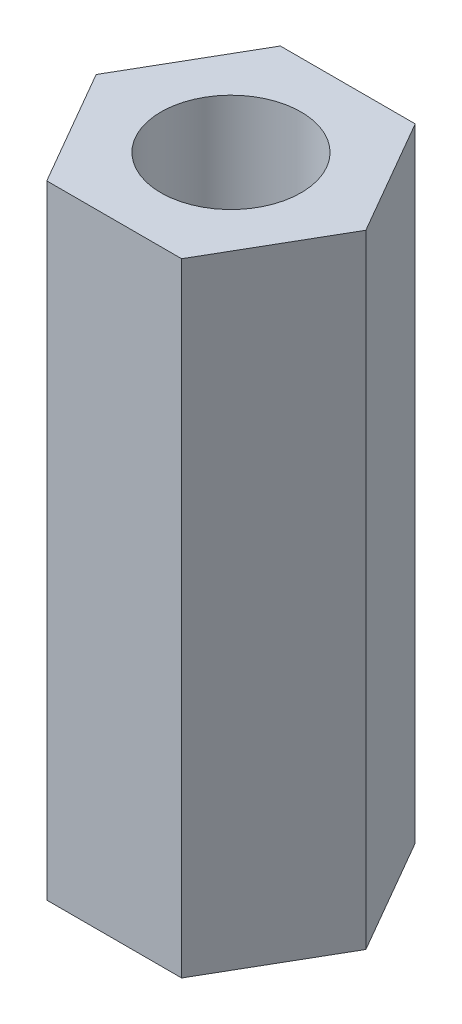
ISO-10303-21;
HEADER;
FILE_DESCRIPTION(('STEP AP214'),'2;1');
FILE_NAME('part.step','',(''),(''),'','','');
FILE_SCHEMA(('AUTOMOTIVE_DESIGN { 1 0 10303 214 1 1 1 1 }'));
ENDSEC;
DATA;
#1=APPLICATION_CONTEXT('core data for automotive mechanical design processes');
#2=APPLICATION_PROTOCOL_DEFINITION('international standard','automotive_design',2000,#1);
#3=PRODUCT_CONTEXT('',#1,'mechanical');
#4=PRODUCT('Part','Part','',(#3));
#5=PRODUCT_RELATED_PRODUCT_CATEGORY('part','',(#4));
#6=PRODUCT_DEFINITION_FORMATION('','',#4);
#7=PRODUCT_DEFINITION_CONTEXT('part definition',#1,'design');
#8=PRODUCT_DEFINITION('design','',#6,#7);
#9=PRODUCT_DEFINITION_SHAPE('','',#8);
#10=(LENGTH_UNIT() NAMED_UNIT(*) SI_UNIT(.MILLI.,.METRE.));
#11=(NAMED_UNIT(*) PLANE_ANGLE_UNIT() SI_UNIT($,.RADIAN.));
#12=(NAMED_UNIT(*) SI_UNIT($,.STERADIAN.) SOLID_ANGLE_UNIT());
#13=UNCERTAINTY_MEASURE_WITH_UNIT(LENGTH_MEASURE(1.E-05),#10,'distance_accuracy_value','');
#14=(GEOMETRIC_REPRESENTATION_CONTEXT(3) GLOBAL_UNCERTAINTY_ASSIGNED_CONTEXT((#13)) GLOBAL_UNIT_ASSIGNED_CONTEXT((#10,
#11,#12)) REPRESENTATION_CONTEXT('',''));
#15=CARTESIAN_POINT('',(0.,0.,0.));
#16=DIRECTION('',(0.,0.,1.));
#17=DIRECTION('',(1.,0.,0.));
#18=AXIS2_PLACEMENT_3D('',#15,#16,#17);
#19=CARTESIAN_POINT('',(-2.59807621135332,12.,0.));
#20=DIRECTION('',(0.866025403784438,0.,-0.5));
#21=DIRECTION('',(-0.5,0.,-0.866025403784439));
#22=AXIS2_PLACEMENT_3D('',#19,#20,#21);
#23=PLANE('',#22);
#24=DIRECTION('',(0.5,0.,0.866025403784439));
#25=VECTOR('',#24,1.);
#26=CARTESIAN_POINT('',(-2.59807621135332,0.,0.));
#27=LINE('',#26,#25);
#28=CARTESIAN_POINT('',(-2.59807621135332,0.,0.));
#29=VERTEX_POINT('',#28);
#30=CARTESIAN_POINT('',(-1.29903810567666,0.,2.25));
#31=VERTEX_POINT('',#30);
#32=EDGE_CURVE('E116',#29,#31,#27,.T.);
#33=ORIENTED_EDGE('',*,*,#32,.T.);
#34=DIRECTION('',(0.,-1.,0.));
#35=VECTOR('',#34,1.);
#36=CARTESIAN_POINT('',(-1.29903810567666,12.,2.25));
#37=LINE('',#36,#35);
#38=CARTESIAN_POINT('',(-1.29903810567666,12.,2.25));
#39=VERTEX_POINT('',#38);
#40=EDGE_CURVE('E11',#39,#31,#37,.T.);
#41=ORIENTED_EDGE('',*,*,#40,.F.);
#42=DIRECTION('',(0.5,0.,0.866025403784439));
#43=VECTOR('',#42,1.);
#44=CARTESIAN_POINT('',(-2.59807621135332,12.,0.));
#45=LINE('',#44,#43);
#46=CARTESIAN_POINT('',(-2.59807621135332,12.,0.));
#47=VERTEX_POINT('',#46);
#48=EDGE_CURVE('E127',#47,#39,#45,.T.);
#49=ORIENTED_EDGE('',*,*,#48,.F.);
#50=DIRECTION('',(0.,-1.,0.));
#51=VECTOR('',#50,1.);
#52=CARTESIAN_POINT('',(-2.59807621135332,12.,0.));
#53=LINE('',#52,#51);
#54=EDGE_CURVE('E112',#47,#29,#53,.T.);
#55=ORIENTED_EDGE('',*,*,#54,.T.);
#56=EDGE_LOOP('',(#33,#41,#49,#55));
#57=FACE_BOUND('',#56,.T.);
#58=ADVANCED_FACE('F32',(#57),#23,.F.);
#59=CARTESIAN_POINT('',(-1.29903810567666,12.,2.25));
#60=DIRECTION('',(0.,0.,-1.));
#61=DIRECTION('',(-1.,0.,0.));
#62=AXIS2_PLACEMENT_3D('',#59,#60,#61);
#63=PLANE('',#62);
#64=DIRECTION('',(1.,0.,0.));
#65=VECTOR('',#64,1.);
#66=CARTESIAN_POINT('',(-1.29903810567666,0.,2.25));
#67=LINE('',#66,#65);
#68=CARTESIAN_POINT('',(1.29903810567666,0.,2.25));
#69=VERTEX_POINT('',#68);
#70=EDGE_CURVE('E119',#31,#69,#67,.T.);
#71=ORIENTED_EDGE('',*,*,#70,.T.);
#72=DIRECTION('',(0.,-1.,0.));
#73=VECTOR('',#72,1.);
#74=CARTESIAN_POINT('',(1.29903810567666,12.,2.25));
#75=LINE('',#74,#73);
#76=CARTESIAN_POINT('',(1.29903810567666,12.,2.25));
#77=VERTEX_POINT('',#76);
#78=EDGE_CURVE('E40',#77,#69,#75,.T.);
#79=ORIENTED_EDGE('',*,*,#78,.F.);
#80=DIRECTION('',(1.,0.,0.));
#81=VECTOR('',#80,1.);
#82=CARTESIAN_POINT('',(-1.29903810567666,12.,2.25));
#83=LINE('',#82,#81);
#84=EDGE_CURVE('E85',#39,#77,#83,.T.);
#85=ORIENTED_EDGE('',*,*,#84,.F.);
#86=ORIENTED_EDGE('',*,*,#40,.T.);
#87=EDGE_LOOP('',(#71,#79,#85,#86));
#88=FACE_BOUND('',#87,.T.);
#89=ADVANCED_FACE('F152',(#88),#63,.F.);
#90=CARTESIAN_POINT('',(1.29903810567666,12.,2.25));
#91=DIRECTION('',(-0.866025403784439,0.,-0.5));
#92=DIRECTION('',(-0.5,0.,0.866025403784439));
#93=AXIS2_PLACEMENT_3D('',#90,#91,#92);
#94=PLANE('',#93);
#95=DIRECTION('',(0.5,0.,-0.866025403784439));
#96=VECTOR('',#95,1.);
#97=CARTESIAN_POINT('',(1.29903810567666,0.,2.25));
#98=LINE('',#97,#96);
#99=CARTESIAN_POINT('',(2.59807621135332,0.,0.));
#100=VERTEX_POINT('',#99);
#101=EDGE_CURVE('E122',#69,#100,#98,.T.);
#102=ORIENTED_EDGE('',*,*,#101,.T.);
#103=DIRECTION('',(0.,-1.,0.));
#104=VECTOR('',#103,1.);
#105=CARTESIAN_POINT('',(2.59807621135332,12.,0.));
#106=LINE('',#105,#104);
#107=CARTESIAN_POINT('',(2.59807621135332,12.,0.));
#108=VERTEX_POINT('',#107);
#109=EDGE_CURVE('E107',#108,#100,#106,.T.);
#110=ORIENTED_EDGE('',*,*,#109,.F.);
#111=DIRECTION('',(0.5,0.,-0.866025403784439));
#112=VECTOR('',#111,1.);
#113=CARTESIAN_POINT('',(1.29903810567666,12.,2.25));
#114=LINE('',#113,#112);
#115=EDGE_CURVE('E98',#77,#108,#114,.T.);
#116=ORIENTED_EDGE('',*,*,#115,.F.);
#117=ORIENTED_EDGE('',*,*,#78,.T.);
#118=EDGE_LOOP('',(#102,#110,#116,#117));
#119=FACE_BOUND('',#118,.T.);
#120=ADVANCED_FACE('F133',(#119),#94,.F.);
#121=CARTESIAN_POINT('',(2.59807621135332,12.,0.));
#122=DIRECTION('',(-0.866025403784438,0.,0.5));
#123=DIRECTION('',(0.5,0.,0.866025403784439));
#124=AXIS2_PLACEMENT_3D('',#121,#122,#123);
#125=PLANE('',#124);
#126=DIRECTION('',(-0.5,0.,-0.866025403784439));
#127=VECTOR('',#126,1.);
#128=CARTESIAN_POINT('',(2.59807621135332,0.,0.));
#129=LINE('',#128,#127);
#130=CARTESIAN_POINT('',(1.29903810567666,0.,-2.25));
#131=VERTEX_POINT('',#130);
#132=EDGE_CURVE('E106',#100,#131,#129,.T.);
#133=ORIENTED_EDGE('',*,*,#132,.T.);
#134=DIRECTION('',(0.,-1.,0.));
#135=VECTOR('',#134,1.);
#136=CARTESIAN_POINT('',(1.29903810567666,12.,-2.25));
#137=LINE('',#136,#135);
#138=CARTESIAN_POINT('',(1.29903810567666,12.,-2.25));
#139=VERTEX_POINT('',#138);
#140=EDGE_CURVE('E103',#139,#131,#137,.T.);
#141=ORIENTED_EDGE('',*,*,#140,.F.);
#142=DIRECTION('',(-0.5,0.,-0.866025403784439));
#143=VECTOR('',#142,1.);
#144=CARTESIAN_POINT('',(2.59807621135332,12.,0.));
#145=LINE('',#144,#143);
#146=EDGE_CURVE('E92',#108,#139,#145,.T.);
#147=ORIENTED_EDGE('',*,*,#146,.F.);
#148=ORIENTED_EDGE('',*,*,#109,.T.);
#149=EDGE_LOOP('',(#133,#141,#147,#148));
#150=FACE_BOUND('',#149,.T.);
#151=ADVANCED_FACE('F104',(#150),#125,.F.);
#152=CARTESIAN_POINT('',(1.29903810567666,12.,-2.25));
#153=DIRECTION('',(0.,0.,1.));
#154=DIRECTION('',(1.,0.,0.));
#155=AXIS2_PLACEMENT_3D('',#152,#153,#154);
#156=PLANE('',#155);
#157=DIRECTION('',(-1.,0.,0.));
#158=VECTOR('',#157,1.);
#159=CARTESIAN_POINT('',(1.29903810567666,0.,-2.25));
#160=LINE('',#159,#158);
#161=CARTESIAN_POINT('',(-1.29903810567666,0.,-2.25));
#162=VERTEX_POINT('',#161);
#163=EDGE_CURVE('E71',#131,#162,#160,.T.);
#164=ORIENTED_EDGE('',*,*,#163,.T.);
#165=DIRECTION('',(0.,-1.,0.));
#166=VECTOR('',#165,1.);
#167=CARTESIAN_POINT('',(-1.29903810567666,12.,-2.25));
#168=LINE('',#167,#166);
#169=CARTESIAN_POINT('',(-1.29903810567666,12.,-2.25));
#170=VERTEX_POINT('',#169);
#171=EDGE_CURVE('E108',#170,#162,#168,.T.);
#172=ORIENTED_EDGE('',*,*,#171,.F.);
#173=DIRECTION('',(-1.,0.,0.));
#174=VECTOR('',#173,1.);
#175=CARTESIAN_POINT('',(1.29903810567666,12.,-2.25));
#176=LINE('',#175,#174);
#177=EDGE_CURVE('E96',#139,#170,#176,.T.);
#178=ORIENTED_EDGE('',*,*,#177,.F.);
#179=ORIENTED_EDGE('',*,*,#140,.T.);
#180=EDGE_LOOP('',(#164,#172,#178,#179));
#181=FACE_BOUND('',#180,.T.);
#182=ADVANCED_FACE('F110',(#181),#156,.F.);
#183=CARTESIAN_POINT('',(-1.29903810567666,12.,-2.25));
#184=DIRECTION('',(0.866025403784439,0.,0.5));
#185=DIRECTION('',(0.5,0.,-0.866025403784439));
#186=AXIS2_PLACEMENT_3D('',#183,#184,#185);
#187=PLANE('',#186);
#188=DIRECTION('',(-0.5,0.,0.866025403784438));
#189=VECTOR('',#188,1.);
#190=CARTESIAN_POINT('',(-1.29903810567666,0.,-2.25));
#191=LINE('',#190,#189);
#192=EDGE_CURVE('E77',#162,#29,#191,.T.);
#193=ORIENTED_EDGE('',*,*,#192,.T.);
#194=ORIENTED_EDGE('',*,*,#54,.F.);
#195=DIRECTION('',(-0.5,0.,0.866025403784438));
#196=VECTOR('',#195,1.);
#197=CARTESIAN_POINT('',(-1.29903810567666,12.,-2.25));
#198=LINE('',#197,#196);
#199=EDGE_CURVE('E48',#170,#47,#198,.T.);
#200=ORIENTED_EDGE('',*,*,#199,.F.);
#201=ORIENTED_EDGE('',*,*,#171,.T.);
#202=EDGE_LOOP('',(#193,#194,#200,#201));
#203=FACE_BOUND('',#202,.T.);
#204=ADVANCED_FACE('F140',(#203),#187,.F.);
#205=CARTESIAN_POINT('',(0.,12.,0.));
#206=DIRECTION('',(0.,1.,0.));
#207=DIRECTION('',(0.,0.,1.));
#208=AXIS2_PLACEMENT_3D('',#205,#206,#207);
#209=PLANE('',#208);
#210=CARTESIAN_POINT('',(0.,12.,0.));
#211=DIRECTION('',(0.,1.,0.));
#212=DIRECTION('',(0.,0.,1.));
#213=AXIS2_PLACEMENT_3D('',#210,#211,#212);
#214=CIRCLE('',#213,1.35);
#215=CARTESIAN_POINT('',(0.,12.,1.35));
#216=VERTEX_POINT('',#215);
#217=EDGE_CURVE('E207',#216,#216,#214,.T.);
#218=ORIENTED_EDGE('',*,*,#217,.F.);
#219=EDGE_LOOP('',(#218));
#220=FACE_BOUND('',#219,.T.);
#221=ORIENTED_EDGE('',*,*,#48,.T.);
#222=ORIENTED_EDGE('',*,*,#84,.T.);
#223=ORIENTED_EDGE('',*,*,#115,.T.);
#224=ORIENTED_EDGE('',*,*,#146,.T.);
#225=ORIENTED_EDGE('',*,*,#177,.T.);
#226=ORIENTED_EDGE('',*,*,#199,.T.);
#227=EDGE_LOOP('',(#221,#222,#223,#224,#225,#226));
#228=FACE_BOUND('',#227,.T.);
#229=ADVANCED_FACE('F94',(#220,#228),#209,.T.);
#230=CARTESIAN_POINT('',(0.,0.,0.));
#231=DIRECTION('',(0.,1.,0.));
#232=DIRECTION('',(0.,0.,1.));
#233=AXIS2_PLACEMENT_3D('',#230,#231,#232);
#234=PLANE('',#233);
#235=CARTESIAN_POINT('',(0.,0.,0.));
#236=DIRECTION('',(0.,1.,0.));
#237=DIRECTION('',(0.,0.,1.));
#238=AXIS2_PLACEMENT_3D('',#235,#236,#237);
#239=CIRCLE('',#238,1.35);
#240=CARTESIAN_POINT('',(0.,0.,1.35));
#241=VERTEX_POINT('',#240);
#242=EDGE_CURVE('E120',#241,#241,#239,.T.);
#243=ORIENTED_EDGE('',*,*,#242,.T.);
#244=EDGE_LOOP('',(#243));
#245=FACE_BOUND('',#244,.T.);
#246=ORIENTED_EDGE('',*,*,#32,.F.);
#247=ORIENTED_EDGE('',*,*,#192,.F.);
#248=ORIENTED_EDGE('',*,*,#163,.F.);
#249=ORIENTED_EDGE('',*,*,#132,.F.);
#250=ORIENTED_EDGE('',*,*,#101,.F.);
#251=ORIENTED_EDGE('',*,*,#70,.F.);
#252=EDGE_LOOP('',(#246,#247,#248,#249,#250,#251));
#253=FACE_BOUND('',#252,.T.);
#254=ADVANCED_FACE('F136',(#245,#253),#234,.F.);
#255=CARTESIAN_POINT('',(0.,0.,0.));
#256=DIRECTION('',(0.,1.,0.));
#257=DIRECTION('',(0.,0.,1.));
#258=AXIS2_PLACEMENT_3D('',#255,#256,#257);
#259=CYLINDRICAL_SURFACE('',#258,1.35);
#260=ORIENTED_EDGE('',*,*,#242,.F.);
#261=EDGE_LOOP('',(#260));
#262=FACE_BOUND('',#261,.T.);
#263=ORIENTED_EDGE('',*,*,#217,.T.);
#264=EDGE_LOOP('',(#263));
#265=FACE_BOUND('',#264,.T.);
#266=ADVANCED_FACE('F189',(#262,#265),#259,.F.);
#267=CLOSED_SHELL('',(#58,#89,#120,#151,#182,#204,#229,#254,#266));
#268=MANIFOLD_SOLID_BREP('B2',#267);
#269=ADVANCED_BREP_SHAPE_REPRESENTATION('',(#18,#268),#14);
#270=SHAPE_DEFINITION_REPRESENTATION(#9,#269);
ENDSEC;
END-ISO-10303-21;
